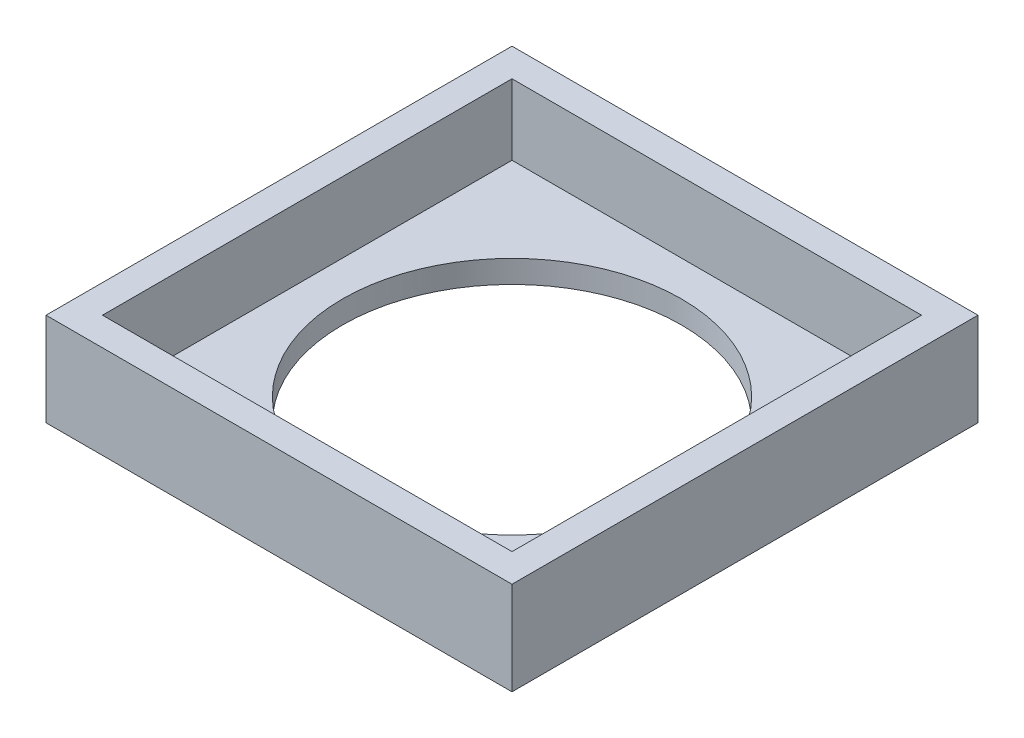
ISO-10303-21;
HEADER;
FILE_DESCRIPTION(('STEP AP214'),'2;1');
FILE_NAME('part.step','',(''),(''),'','','');
FILE_SCHEMA(('AUTOMOTIVE_DESIGN { 1 0 10303 214 1 1 1 1 }'));
ENDSEC;
DATA;
#1=APPLICATION_CONTEXT('core data for automotive mechanical design processes');
#2=APPLICATION_PROTOCOL_DEFINITION('international standard','automotive_design',2000,#1);
#3=PRODUCT_CONTEXT('',#1,'mechanical');
#4=PRODUCT('Part','Part','',(#3));
#5=PRODUCT_RELATED_PRODUCT_CATEGORY('part','',(#4));
#6=PRODUCT_DEFINITION_FORMATION('','',#4);
#7=PRODUCT_DEFINITION_CONTEXT('part definition',#1,'design');
#8=PRODUCT_DEFINITION('design','',#6,#7);
#9=PRODUCT_DEFINITION_SHAPE('','',#8);
#10=(LENGTH_UNIT() NAMED_UNIT(*) SI_UNIT(.MILLI.,.METRE.));
#11=(NAMED_UNIT(*) PLANE_ANGLE_UNIT() SI_UNIT($,.RADIAN.));
#12=(NAMED_UNIT(*) SI_UNIT($,.STERADIAN.) SOLID_ANGLE_UNIT());
#13=UNCERTAINTY_MEASURE_WITH_UNIT(LENGTH_MEASURE(1.E-05),#10,'distance_accuracy_value','');
#14=(GEOMETRIC_REPRESENTATION_CONTEXT(3) GLOBAL_UNCERTAINTY_ASSIGNED_CONTEXT((#13)) GLOBAL_UNIT_ASSIGNED_CONTEXT((#10,
#11,#12)) REPRESENTATION_CONTEXT('',''));
#15=CARTESIAN_POINT('',(0.,0.,0.));
#16=DIRECTION('',(0.,0.,1.));
#17=DIRECTION('',(1.,0.,0.));
#18=AXIS2_PLACEMENT_3D('',#15,#16,#17);
#19=CARTESIAN_POINT('',(16.5,6.6,-16.5));
#20=DIRECTION('',(-1.,0.,0.));
#21=DIRECTION('',(0.,0.,1.));
#22=AXIS2_PLACEMENT_3D('',#19,#20,#21);
#23=PLANE('',#22);
#24=DIRECTION('',(0.,0.,-1.));
#25=VECTOR('',#24,1.);
#26=CARTESIAN_POINT('',(16.5,0.,-16.5));
#27=LINE('',#26,#25);
#28=CARTESIAN_POINT('',(16.5,0.,16.5));
#29=VERTEX_POINT('',#28);
#30=CARTESIAN_POINT('',(16.5,0.,-16.5));
#31=VERTEX_POINT('',#30);
#32=EDGE_CURVE('E146',#29,#31,#27,.T.);
#33=ORIENTED_EDGE('',*,*,#32,.T.);
#34=DIRECTION('',(0.,-1.,0.));
#35=VECTOR('',#34,1.);
#36=CARTESIAN_POINT('',(16.5,6.6,-16.5));
#37=LINE('',#36,#35);
#38=CARTESIAN_POINT('',(16.5,6.6,-16.5));
#39=VERTEX_POINT('',#38);
#40=EDGE_CURVE('E11',#39,#31,#37,.T.);
#41=ORIENTED_EDGE('',*,*,#40,.F.);
#42=DIRECTION('',(0.,0.,-1.));
#43=VECTOR('',#42,1.);
#44=CARTESIAN_POINT('',(16.5,6.6,-16.5));
#45=LINE('',#44,#43);
#46=CARTESIAN_POINT('',(16.5,6.6,16.5));
#47=VERTEX_POINT('',#46);
#48=EDGE_CURVE('E150',#47,#39,#45,.T.);
#49=ORIENTED_EDGE('',*,*,#48,.F.);
#50=DIRECTION('',(0.,-1.,0.));
#51=VECTOR('',#50,1.);
#52=CARTESIAN_POINT('',(16.5,6.6,16.5));
#53=LINE('',#52,#51);
#54=EDGE_CURVE('E156',#47,#29,#53,.T.);
#55=ORIENTED_EDGE('',*,*,#54,.T.);
#56=EDGE_LOOP('',(#33,#41,#49,#55));
#57=FACE_BOUND('',#56,.T.);
#58=ADVANCED_FACE('F35',(#57),#23,.F.);
#59=CARTESIAN_POINT('',(-16.5,6.6,-16.5));
#60=DIRECTION('',(0.,0.,1.));
#61=DIRECTION('',(1.,0.,0.));
#62=AXIS2_PLACEMENT_3D('',#59,#60,#61);
#63=PLANE('',#62);
#64=DIRECTION('',(-1.,0.,0.));
#65=VECTOR('',#64,1.);
#66=CARTESIAN_POINT('',(-16.5,0.,-16.5));
#67=LINE('',#66,#65);
#68=CARTESIAN_POINT('',(-16.5,0.,-16.5));
#69=VERTEX_POINT('',#68);
#70=EDGE_CURVE('E159',#31,#69,#67,.T.);
#71=ORIENTED_EDGE('',*,*,#70,.T.);
#72=DIRECTION('',(0.,-1.,0.));
#73=VECTOR('',#72,1.);
#74=CARTESIAN_POINT('',(-16.5,6.6,-16.5));
#75=LINE('',#74,#73);
#76=CARTESIAN_POINT('',(-16.5,6.6,-16.5));
#77=VERTEX_POINT('',#76);
#78=EDGE_CURVE('E43',#77,#69,#75,.T.);
#79=ORIENTED_EDGE('',*,*,#78,.F.);
#80=DIRECTION('',(-1.,0.,0.));
#81=VECTOR('',#80,1.);
#82=CARTESIAN_POINT('',(-16.5,6.6,-16.5));
#83=LINE('',#82,#81);
#84=EDGE_CURVE('E87',#39,#77,#83,.T.);
#85=ORIENTED_EDGE('',*,*,#84,.F.);
#86=ORIENTED_EDGE('',*,*,#40,.T.);
#87=EDGE_LOOP('',(#71,#79,#85,#86));
#88=FACE_BOUND('',#87,.T.);
#89=ADVANCED_FACE('F189',(#88),#63,.F.);
#90=CARTESIAN_POINT('',(-16.5,6.6,-16.5));
#91=DIRECTION('',(1.,0.,0.));
#92=DIRECTION('',(0.,0.,-1.));
#93=AXIS2_PLACEMENT_3D('',#90,#91,#92);
#94=PLANE('',#93);
#95=DIRECTION('',(0.,0.,1.));
#96=VECTOR('',#95,1.);
#97=CARTESIAN_POINT('',(-16.5,0.,-16.5));
#98=LINE('',#97,#96);
#99=CARTESIAN_POINT('',(-16.5,0.,16.5));
#100=VERTEX_POINT('',#99);
#101=EDGE_CURVE('E161',#69,#100,#98,.T.);
#102=ORIENTED_EDGE('',*,*,#101,.T.);
#103=DIRECTION('',(0.,-1.,0.));
#104=VECTOR('',#103,1.);
#105=CARTESIAN_POINT('',(-16.5,6.6,16.5));
#106=LINE('',#105,#104);
#107=CARTESIAN_POINT('',(-16.5,6.6,16.5));
#108=VERTEX_POINT('',#107);
#109=EDGE_CURVE('E165',#108,#100,#106,.T.);
#110=ORIENTED_EDGE('',*,*,#109,.F.);
#111=DIRECTION('',(0.,0.,1.));
#112=VECTOR('',#111,1.);
#113=CARTESIAN_POINT('',(-16.5,6.6,-16.5));
#114=LINE('',#113,#112);
#115=EDGE_CURVE('E153',#77,#108,#114,.T.);
#116=ORIENTED_EDGE('',*,*,#115,.F.);
#117=ORIENTED_EDGE('',*,*,#78,.T.);
#118=EDGE_LOOP('',(#102,#110,#116,#117));
#119=FACE_BOUND('',#118,.T.);
#120=ADVANCED_FACE('F171',(#119),#94,.F.);
#121=CARTESIAN_POINT('',(-16.5,6.6,16.5));
#122=DIRECTION('',(0.,0.,-1.));
#123=DIRECTION('',(-1.,0.,0.));
#124=AXIS2_PLACEMENT_3D('',#121,#122,#123);
#125=PLANE('',#124);
#126=DIRECTION('',(1.,0.,0.));
#127=VECTOR('',#126,1.);
#128=CARTESIAN_POINT('',(-16.5,0.,16.5));
#129=LINE('',#128,#127);
#130=EDGE_CURVE('E80',#100,#29,#129,.T.);
#131=ORIENTED_EDGE('',*,*,#130,.T.);
#132=ORIENTED_EDGE('',*,*,#54,.F.);
#133=DIRECTION('',(1.,0.,0.));
#134=VECTOR('',#133,1.);
#135=CARTESIAN_POINT('',(-16.5,6.6,16.5));
#136=LINE('',#135,#134);
#137=EDGE_CURVE('E59',#108,#47,#136,.T.);
#138=ORIENTED_EDGE('',*,*,#137,.F.);
#139=ORIENTED_EDGE('',*,*,#109,.T.);
#140=EDGE_LOOP('',(#131,#132,#138,#139));
#141=FACE_BOUND('',#140,.T.);
#142=ADVANCED_FACE('F179',(#141),#125,.F.);
#143=CARTESIAN_POINT('',(0.,6.6,0.));
#144=DIRECTION('',(0.,1.,0.));
#145=DIRECTION('',(0.,0.,1.));
#146=AXIS2_PLACEMENT_3D('',#143,#144,#145);
#147=PLANE('',#146);
#148=DIRECTION('',(1.,0.,0.));
#149=VECTOR('',#148,1.);
#150=CARTESIAN_POINT('',(0.,6.6,14.5));
#151=LINE('',#150,#149);
#152=CARTESIAN_POINT('',(-14.5,6.6,14.5));
#153=VERTEX_POINT('',#152);
#154=CARTESIAN_POINT('',(14.5,6.6,14.5));
#155=VERTEX_POINT('',#154);
#156=EDGE_CURVE('E50',#153,#155,#151,.T.);
#157=ORIENTED_EDGE('',*,*,#156,.F.);
#158=DIRECTION('',(0.,0.,1.));
#159=VECTOR('',#158,1.);
#160=CARTESIAN_POINT('',(-14.5,6.6,0.));
#161=LINE('',#160,#159);
#162=CARTESIAN_POINT('',(-14.5,6.6,-14.5));
#163=VERTEX_POINT('',#162);
#164=EDGE_CURVE('E129',#163,#153,#161,.T.);
#165=ORIENTED_EDGE('',*,*,#164,.F.);
#166=DIRECTION('',(-1.,0.,0.));
#167=VECTOR('',#166,1.);
#168=CARTESIAN_POINT('',(0.,6.6,-14.5));
#169=LINE('',#168,#167);
#170=CARTESIAN_POINT('',(14.5,6.6,-14.5));
#171=VERTEX_POINT('',#170);
#172=EDGE_CURVE('E132',#171,#163,#169,.T.);
#173=ORIENTED_EDGE('',*,*,#172,.F.);
#174=DIRECTION('',(0.,0.,-1.));
#175=VECTOR('',#174,1.);
#176=CARTESIAN_POINT('',(14.5,6.6,0.));
#177=LINE('',#176,#175);
#178=EDGE_CURVE('E140',#155,#171,#177,.T.);
#179=ORIENTED_EDGE('',*,*,#178,.F.);
#180=EDGE_LOOP('',(#157,#165,#173,#179));
#181=FACE_BOUND('',#180,.T.);
#182=ORIENTED_EDGE('',*,*,#48,.T.);
#183=ORIENTED_EDGE('',*,*,#84,.T.);
#184=ORIENTED_EDGE('',*,*,#115,.T.);
#185=ORIENTED_EDGE('',*,*,#137,.T.);
#186=EDGE_LOOP('',(#182,#183,#184,#185));
#187=FACE_BOUND('',#186,.T.);
#188=ADVANCED_FACE('F181',(#181,#187),#147,.T.);
#189=CARTESIAN_POINT('',(0.,0.,0.));
#190=DIRECTION('',(0.,1.,0.));
#191=DIRECTION('',(0.,0.,1.));
#192=AXIS2_PLACEMENT_3D('',#189,#190,#191);
#193=PLANE('',#192);
#194=CARTESIAN_POINT('',(0.,0.,0.));
#195=DIRECTION('',(0.,1.,0.));
#196=DIRECTION('',(0.,0.,1.));
#197=AXIS2_PLACEMENT_3D('',#194,#195,#196);
#198=CIRCLE('',#197,12.);
#199=CARTESIAN_POINT('',(0.,0.,12.));
#200=VERTEX_POINT('',#199);
#201=EDGE_CURVE('E38',#200,#200,#198,.T.);
#202=ORIENTED_EDGE('',*,*,#201,.T.);
#203=EDGE_LOOP('',(#202));
#204=FACE_BOUND('',#203,.T.);
#205=ORIENTED_EDGE('',*,*,#32,.F.);
#206=ORIENTED_EDGE('',*,*,#130,.F.);
#207=ORIENTED_EDGE('',*,*,#101,.F.);
#208=ORIENTED_EDGE('',*,*,#70,.F.);
#209=EDGE_LOOP('',(#205,#206,#207,#208));
#210=FACE_BOUND('',#209,.T.);
#211=ADVANCED_FACE('F175',(#204,#210),#193,.F.);
#212=CARTESIAN_POINT('',(0.,1.6,14.5));
#213=DIRECTION('',(0.,0.,1.));
#214=DIRECTION('',(1.,0.,0.));
#215=AXIS2_PLACEMENT_3D('',#212,#213,#214);
#216=PLANE('',#215);
#217=ORIENTED_EDGE('',*,*,#156,.T.);
#218=DIRECTION('',(0.,1.,0.));
#219=VECTOR('',#218,1.);
#220=CARTESIAN_POINT('',(14.5,1.6,14.5));
#221=LINE('',#220,#219);
#222=CARTESIAN_POINT('',(14.5,1.6,14.5));
#223=VERTEX_POINT('',#222);
#224=EDGE_CURVE('E107',#223,#155,#221,.T.);
#225=ORIENTED_EDGE('',*,*,#224,.F.);
#226=DIRECTION('',(1.,0.,0.));
#227=VECTOR('',#226,1.);
#228=CARTESIAN_POINT('',(0.,1.6,14.5));
#229=LINE('',#228,#227);
#230=CARTESIAN_POINT('',(-14.5,1.6,14.5));
#231=VERTEX_POINT('',#230);
#232=EDGE_CURVE('E111',#231,#223,#229,.T.);
#233=ORIENTED_EDGE('',*,*,#232,.F.);
#234=DIRECTION('',(0.,1.,0.));
#235=VECTOR('',#234,1.);
#236=CARTESIAN_POINT('',(-14.5,1.6,14.5));
#237=LINE('',#236,#235);
#238=EDGE_CURVE('E144',#231,#153,#237,.T.);
#239=ORIENTED_EDGE('',*,*,#238,.T.);
#240=EDGE_LOOP('',(#217,#225,#233,#239));
#241=FACE_BOUND('',#240,.T.);
#242=ADVANCED_FACE('F109',(#241),#216,.F.);
#243=CARTESIAN_POINT('',(-14.5,1.6,0.));
#244=DIRECTION('',(-1.,0.,0.));
#245=DIRECTION('',(0.,0.,1.));
#246=AXIS2_PLACEMENT_3D('',#243,#244,#245);
#247=PLANE('',#246);
#248=ORIENTED_EDGE('',*,*,#164,.T.);
#249=ORIENTED_EDGE('',*,*,#238,.F.);
#250=DIRECTION('',(0.,0.,1.));
#251=VECTOR('',#250,1.);
#252=CARTESIAN_POINT('',(-14.5,1.6,0.));
#253=LINE('',#252,#251);
#254=CARTESIAN_POINT('',(-14.5,1.6,-14.5));
#255=VERTEX_POINT('',#254);
#256=EDGE_CURVE('E117',#255,#231,#253,.T.);
#257=ORIENTED_EDGE('',*,*,#256,.F.);
#258=DIRECTION('',(0.,1.,0.));
#259=VECTOR('',#258,1.);
#260=CARTESIAN_POINT('',(-14.5,1.6,-14.5));
#261=LINE('',#260,#259);
#262=EDGE_CURVE('E147',#255,#163,#261,.T.);
#263=ORIENTED_EDGE('',*,*,#262,.T.);
#264=EDGE_LOOP('',(#248,#249,#257,#263));
#265=FACE_BOUND('',#264,.T.);
#266=ADVANCED_FACE('F223',(#265),#247,.F.);
#267=CARTESIAN_POINT('',(0.,1.6,-14.5));
#268=DIRECTION('',(0.,0.,-1.));
#269=DIRECTION('',(-1.,0.,0.));
#270=AXIS2_PLACEMENT_3D('',#267,#268,#269);
#271=PLANE('',#270);
#272=ORIENTED_EDGE('',*,*,#172,.T.);
#273=ORIENTED_EDGE('',*,*,#262,.F.);
#274=DIRECTION('',(-1.,0.,0.));
#275=VECTOR('',#274,1.);
#276=CARTESIAN_POINT('',(0.,1.6,-14.5));
#277=LINE('',#276,#275);
#278=CARTESIAN_POINT('',(14.5,1.6,-14.5));
#279=VERTEX_POINT('',#278);
#280=EDGE_CURVE('E125',#279,#255,#277,.T.);
#281=ORIENTED_EDGE('',*,*,#280,.F.);
#282=DIRECTION('',(0.,1.,0.));
#283=VECTOR('',#282,1.);
#284=CARTESIAN_POINT('',(14.5,1.6,-14.5));
#285=LINE('',#284,#283);
#286=EDGE_CURVE('E116',#279,#171,#285,.T.);
#287=ORIENTED_EDGE('',*,*,#286,.T.);
#288=EDGE_LOOP('',(#272,#273,#281,#287));
#289=FACE_BOUND('',#288,.T.);
#290=ADVANCED_FACE('F232',(#289),#271,.F.);
#291=CARTESIAN_POINT('',(14.5,1.6,0.));
#292=DIRECTION('',(1.,0.,0.));
#293=DIRECTION('',(0.,0.,-1.));
#294=AXIS2_PLACEMENT_3D('',#291,#292,#293);
#295=PLANE('',#294);
#296=ORIENTED_EDGE('',*,*,#178,.T.);
#297=ORIENTED_EDGE('',*,*,#286,.F.);
#298=DIRECTION('',(0.,0.,-1.));
#299=VECTOR('',#298,1.);
#300=CARTESIAN_POINT('',(14.5,1.6,0.));
#301=LINE('',#300,#299);
#302=EDGE_CURVE('E120',#223,#279,#301,.T.);
#303=ORIENTED_EDGE('',*,*,#302,.F.);
#304=ORIENTED_EDGE('',*,*,#224,.T.);
#305=EDGE_LOOP('',(#296,#297,#303,#304));
#306=FACE_BOUND('',#305,.T.);
#307=ADVANCED_FACE('F121',(#306),#295,.F.);
#308=CARTESIAN_POINT('',(0.,1.6,0.));
#309=DIRECTION('',(0.,1.,0.));
#310=DIRECTION('',(0.,0.,1.));
#311=AXIS2_PLACEMENT_3D('',#308,#309,#310);
#312=PLANE('',#311);
#313=CARTESIAN_POINT('',(0.,1.6,0.));
#314=DIRECTION('',(0.,1.,0.));
#315=DIRECTION('',(0.,0.,1.));
#316=AXIS2_PLACEMENT_3D('',#313,#314,#315);
#317=CIRCLE('',#316,12.);
#318=CARTESIAN_POINT('',(0.,1.6,12.));
#319=VERTEX_POINT('',#318);
#320=EDGE_CURVE('E135',#319,#319,#317,.T.);
#321=ORIENTED_EDGE('',*,*,#320,.F.);
#322=EDGE_LOOP('',(#321));
#323=FACE_BOUND('',#322,.T.);
#324=ORIENTED_EDGE('',*,*,#232,.T.);
#325=ORIENTED_EDGE('',*,*,#302,.T.);
#326=ORIENTED_EDGE('',*,*,#280,.T.);
#327=ORIENTED_EDGE('',*,*,#256,.T.);
#328=EDGE_LOOP('',(#324,#325,#326,#327));
#329=FACE_BOUND('',#328,.T.);
#330=ADVANCED_FACE('F127',(#323,#329),#312,.T.);
#331=CARTESIAN_POINT('',(0.,-3.4,0.));
#332=DIRECTION('',(0.,1.,0.));
#333=DIRECTION('',(0.,0.,1.));
#334=AXIS2_PLACEMENT_3D('',#331,#332,#333);
#335=CYLINDRICAL_SURFACE('',#334,12.);
#336=ORIENTED_EDGE('',*,*,#320,.T.);
#337=EDGE_LOOP('',(#336));
#338=FACE_BOUND('',#337,.T.);
#339=ORIENTED_EDGE('',*,*,#201,.F.);
#340=EDGE_LOOP('',(#339));
#341=FACE_BOUND('',#340,.T.);
#342=ADVANCED_FACE('F265',(#338,#341),#335,.F.);
#343=CLOSED_SHELL('',(#58,#89,#120,#142,#188,#211,#242,#266,#290,#307,#330,#342));
#344=MANIFOLD_SOLID_BREP('B2',#343);
#345=ADVANCED_BREP_SHAPE_REPRESENTATION('',(#18,#344),#14);
#346=SHAPE_DEFINITION_REPRESENTATION(#9,#345);
ENDSEC;
END-ISO-10303-21;
